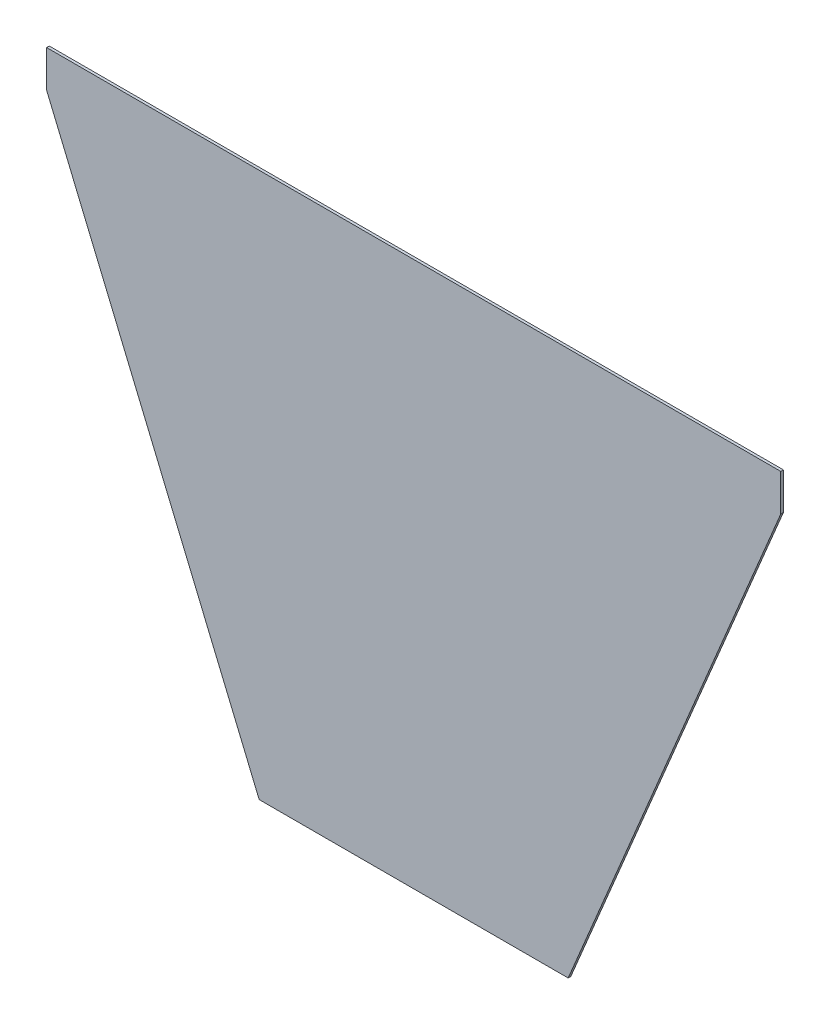
ISO-10303-21;
HEADER;
FILE_DESCRIPTION(('STEP AP214'),'2;1');
FILE_NAME('part.step','',(''),(''),'','','');
FILE_SCHEMA(('AUTOMOTIVE_DESIGN { 1 0 10303 214 1 1 1 1 }'));
ENDSEC;
DATA;
#1=APPLICATION_CONTEXT('core data for automotive mechanical design processes');
#2=APPLICATION_PROTOCOL_DEFINITION('international standard','automotive_design',2000,#1);
#3=PRODUCT_CONTEXT('',#1,'mechanical');
#4=PRODUCT('Part','Part','',(#3));
#5=PRODUCT_RELATED_PRODUCT_CATEGORY('part','',(#4));
#6=PRODUCT_DEFINITION_FORMATION('','',#4);
#7=PRODUCT_DEFINITION_CONTEXT('part definition',#1,'design');
#8=PRODUCT_DEFINITION('design','',#6,#7);
#9=PRODUCT_DEFINITION_SHAPE('','',#8);
#10=(LENGTH_UNIT() NAMED_UNIT(*) SI_UNIT(.MILLI.,.METRE.));
#11=(NAMED_UNIT(*) PLANE_ANGLE_UNIT() SI_UNIT($,.RADIAN.));
#12=(NAMED_UNIT(*) SI_UNIT($,.STERADIAN.) SOLID_ANGLE_UNIT());
#13=UNCERTAINTY_MEASURE_WITH_UNIT(LENGTH_MEASURE(1.E-05),#10,'distance_accuracy_value','');
#14=(GEOMETRIC_REPRESENTATION_CONTEXT(3) GLOBAL_UNCERTAINTY_ASSIGNED_CONTEXT((#13)) GLOBAL_UNIT_ASSIGNED_CONTEXT((#10,
#11,#12)) REPRESENTATION_CONTEXT('',''));
#15=CARTESIAN_POINT('',(0.,0.,0.));
#16=DIRECTION('',(0.,0.,1.));
#17=DIRECTION('',(1.,0.,0.));
#18=AXIS2_PLACEMENT_3D('',#15,#16,#17);
#19=CARTESIAN_POINT('',(-695.,0.,5.));
#20=DIRECTION('',(1.,0.,0.));
#21=DIRECTION('',(0.,0.,-1.));
#22=AXIS2_PLACEMENT_3D('',#19,#20,#21);
#23=PLANE('',#22);
#24=DIRECTION('',(0.,-1.,0.));
#25=VECTOR('',#24,1.);
#26=CARTESIAN_POINT('',(-695.,0.,0.));
#27=LINE('',#26,#25);
#28=CARTESIAN_POINT('',(-695.,0.,0.));
#29=VERTEX_POINT('',#28);
#30=CARTESIAN_POINT('',(-695.,-70.,0.));
#31=VERTEX_POINT('',#30);
#32=EDGE_CURVE('E118',#29,#31,#27,.T.);
#33=ORIENTED_EDGE('',*,*,#32,.T.);
#34=DIRECTION('',(0.,0.,-1.));
#35=VECTOR('',#34,1.);
#36=CARTESIAN_POINT('',(-695.,-70.,5.));
#37=LINE('',#36,#35);
#38=CARTESIAN_POINT('',(-695.,-70.,5.));
#39=VERTEX_POINT('',#38);
#40=EDGE_CURVE('E11',#39,#31,#37,.T.);
#41=ORIENTED_EDGE('',*,*,#40,.F.);
#42=DIRECTION('',(0.,-1.,0.));
#43=VECTOR('',#42,1.);
#44=CARTESIAN_POINT('',(-695.,0.,5.));
#45=LINE('',#44,#43);
#46=CARTESIAN_POINT('',(-695.,0.,5.));
#47=VERTEX_POINT('',#46);
#48=EDGE_CURVE('E128',#47,#39,#45,.T.);
#49=ORIENTED_EDGE('',*,*,#48,.F.);
#50=DIRECTION('',(0.,0.,-1.));
#51=VECTOR('',#50,1.);
#52=CARTESIAN_POINT('',(-695.,0.,5.));
#53=LINE('',#52,#51);
#54=EDGE_CURVE('E114',#47,#29,#53,.T.);
#55=ORIENTED_EDGE('',*,*,#54,.T.);
#56=EDGE_LOOP('',(#33,#41,#49,#55));
#57=FACE_BOUND('',#56,.T.);
#58=ADVANCED_FACE('F34',(#57),#23,.F.);
#59=CARTESIAN_POINT('',(-695.,-70.,5.));
#60=DIRECTION('',(0.922508493355555,0.385976786461134,0.));
#61=DIRECTION('',(-0.385976786461134,0.922508493355555,0.));
#62=AXIS2_PLACEMENT_3D('',#59,#60,#61);
#63=PLANE('',#62);
#64=DIRECTION('',(0.385976786461134,-0.922508493355555,0.));
#65=VECTOR('',#64,1.);
#66=CARTESIAN_POINT('',(-695.,-70.,0.));
#67=LINE('',#66,#65);
#68=CARTESIAN_POINT('',(-292.5,-1032.,0.));
#69=VERTEX_POINT('',#68);
#70=EDGE_CURVE('E121',#31,#69,#67,.T.);
#71=ORIENTED_EDGE('',*,*,#70,.T.);
#72=DIRECTION('',(0.,0.,-1.));
#73=VECTOR('',#72,1.);
#74=CARTESIAN_POINT('',(-292.5,-1032.,5.));
#75=LINE('',#74,#73);
#76=CARTESIAN_POINT('',(-292.5,-1032.,5.));
#77=VERTEX_POINT('',#76);
#78=EDGE_CURVE('E42',#77,#69,#75,.T.);
#79=ORIENTED_EDGE('',*,*,#78,.F.);
#80=DIRECTION('',(0.385976786461134,-0.922508493355555,0.));
#81=VECTOR('',#80,1.);
#82=CARTESIAN_POINT('',(-695.,-70.,5.));
#83=LINE('',#82,#81);
#84=EDGE_CURVE('E87',#39,#77,#83,.T.);
#85=ORIENTED_EDGE('',*,*,#84,.F.);
#86=ORIENTED_EDGE('',*,*,#40,.T.);
#87=EDGE_LOOP('',(#71,#79,#85,#86));
#88=FACE_BOUND('',#87,.T.);
#89=ADVANCED_FACE('F152',(#88),#63,.F.);
#90=CARTESIAN_POINT('',(-292.5,-1032.,5.));
#91=DIRECTION('',(0.,1.,0.));
#92=DIRECTION('',(0.,0.,1.));
#93=AXIS2_PLACEMENT_3D('',#90,#91,#92);
#94=PLANE('',#93);
#95=DIRECTION('',(1.,0.,0.));
#96=VECTOR('',#95,1.);
#97=CARTESIAN_POINT('',(-292.5,-1032.,0.));
#98=LINE('',#97,#96);
#99=CARTESIAN_POINT('',(292.5,-1032.,0.));
#100=VERTEX_POINT('',#99);
#101=EDGE_CURVE('E123',#69,#100,#98,.T.);
#102=ORIENTED_EDGE('',*,*,#101,.T.);
#103=DIRECTION('',(0.,0.,-1.));
#104=VECTOR('',#103,1.);
#105=CARTESIAN_POINT('',(292.5,-1032.,5.));
#106=LINE('',#105,#104);
#107=CARTESIAN_POINT('',(292.5,-1032.,5.));
#108=VERTEX_POINT('',#107);
#109=EDGE_CURVE('E109',#108,#100,#106,.T.);
#110=ORIENTED_EDGE('',*,*,#109,.F.);
#111=DIRECTION('',(1.,0.,0.));
#112=VECTOR('',#111,1.);
#113=CARTESIAN_POINT('',(-292.5,-1032.,5.));
#114=LINE('',#113,#112);
#115=EDGE_CURVE('E100',#77,#108,#114,.T.);
#116=ORIENTED_EDGE('',*,*,#115,.F.);
#117=ORIENTED_EDGE('',*,*,#78,.T.);
#118=EDGE_LOOP('',(#102,#110,#116,#117));
#119=FACE_BOUND('',#118,.T.);
#120=ADVANCED_FACE('F134',(#119),#94,.F.);
#121=CARTESIAN_POINT('',(695.,-70.,5.));
#122=DIRECTION('',(-0.922508493355555,0.385976786461134,0.));
#123=DIRECTION('',(-0.385976786461134,-0.922508493355555,0.));
#124=AXIS2_PLACEMENT_3D('',#121,#122,#123);
#125=PLANE('',#124);
#126=DIRECTION('',(0.385976786461134,0.922508493355555,0.));
#127=VECTOR('',#126,1.);
#128=CARTESIAN_POINT('',(695.,-70.,0.));
#129=LINE('',#128,#127);
#130=CARTESIAN_POINT('',(695.,-70.,0.));
#131=VERTEX_POINT('',#130);
#132=EDGE_CURVE('E108',#100,#131,#129,.T.);
#133=ORIENTED_EDGE('',*,*,#132,.T.);
#134=DIRECTION('',(0.,0.,-1.));
#135=VECTOR('',#134,1.);
#136=CARTESIAN_POINT('',(695.,-70.,5.));
#137=LINE('',#136,#135);
#138=CARTESIAN_POINT('',(695.,-70.,5.));
#139=VERTEX_POINT('',#138);
#140=EDGE_CURVE('E105',#139,#131,#137,.T.);
#141=ORIENTED_EDGE('',*,*,#140,.F.);
#142=DIRECTION('',(0.385976786461134,0.922508493355555,0.));
#143=VECTOR('',#142,1.);
#144=CARTESIAN_POINT('',(695.,-70.,5.));
#145=LINE('',#144,#143);
#146=EDGE_CURVE('E94',#108,#139,#145,.T.);
#147=ORIENTED_EDGE('',*,*,#146,.F.);
#148=ORIENTED_EDGE('',*,*,#109,.T.);
#149=EDGE_LOOP('',(#133,#141,#147,#148));
#150=FACE_BOUND('',#149,.T.);
#151=ADVANCED_FACE('F106',(#150),#125,.F.);
#152=CARTESIAN_POINT('',(695.,0.,5.));
#153=DIRECTION('',(-1.,0.,0.));
#154=DIRECTION('',(0.,0.,1.));
#155=AXIS2_PLACEMENT_3D('',#152,#153,#154);
#156=PLANE('',#155);
#157=DIRECTION('',(0.,1.,0.));
#158=VECTOR('',#157,1.);
#159=CARTESIAN_POINT('',(695.,0.,0.));
#160=LINE('',#159,#158);
#161=CARTESIAN_POINT('',(695.,0.,0.));
#162=VERTEX_POINT('',#161);
#163=EDGE_CURVE('E73',#131,#162,#160,.T.);
#164=ORIENTED_EDGE('',*,*,#163,.T.);
#165=DIRECTION('',(0.,0.,-1.));
#166=VECTOR('',#165,1.);
#167=CARTESIAN_POINT('',(695.,0.,5.));
#168=LINE('',#167,#166);
#169=CARTESIAN_POINT('',(695.,0.,5.));
#170=VERTEX_POINT('',#169);
#171=EDGE_CURVE('E110',#170,#162,#168,.T.);
#172=ORIENTED_EDGE('',*,*,#171,.F.);
#173=DIRECTION('',(0.,1.,0.));
#174=VECTOR('',#173,1.);
#175=CARTESIAN_POINT('',(695.,0.,5.));
#176=LINE('',#175,#174);
#177=EDGE_CURVE('E98',#139,#170,#176,.T.);
#178=ORIENTED_EDGE('',*,*,#177,.F.);
#179=ORIENTED_EDGE('',*,*,#140,.T.);
#180=EDGE_LOOP('',(#164,#172,#178,#179));
#181=FACE_BOUND('',#180,.T.);
#182=ADVANCED_FACE('F112',(#181),#156,.F.);
#183=CARTESIAN_POINT('',(-695.,0.,5.));
#184=DIRECTION('',(0.,-1.,0.));
#185=DIRECTION('',(0.,0.,-1.));
#186=AXIS2_PLACEMENT_3D('',#183,#184,#185);
#187=PLANE('',#186);
#188=DIRECTION('',(-1.,0.,0.));
#189=VECTOR('',#188,1.);
#190=CARTESIAN_POINT('',(-695.,0.,0.));
#191=LINE('',#190,#189);
#192=EDGE_CURVE('E79',#162,#29,#191,.T.);
#193=ORIENTED_EDGE('',*,*,#192,.T.);
#194=ORIENTED_EDGE('',*,*,#54,.F.);
#195=DIRECTION('',(-1.,0.,0.));
#196=VECTOR('',#195,1.);
#197=CARTESIAN_POINT('',(-695.,0.,5.));
#198=LINE('',#197,#196);
#199=EDGE_CURVE('E50',#170,#47,#198,.T.);
#200=ORIENTED_EDGE('',*,*,#199,.F.);
#201=ORIENTED_EDGE('',*,*,#171,.T.);
#202=EDGE_LOOP('',(#193,#194,#200,#201));
#203=FACE_BOUND('',#202,.T.);
#204=ADVANCED_FACE('F141',(#203),#187,.F.);
#205=CARTESIAN_POINT('',(-695.,-1032.,5.));
#206=DIRECTION('',(0.,0.,1.));
#207=DIRECTION('',(1.,0.,0.));
#208=AXIS2_PLACEMENT_3D('',#205,#206,#207);
#209=PLANE('',#208);
#210=ORIENTED_EDGE('',*,*,#48,.T.);
#211=ORIENTED_EDGE('',*,*,#84,.T.);
#212=ORIENTED_EDGE('',*,*,#115,.T.);
#213=ORIENTED_EDGE('',*,*,#146,.T.);
#214=ORIENTED_EDGE('',*,*,#177,.T.);
#215=ORIENTED_EDGE('',*,*,#199,.T.);
#216=EDGE_LOOP('',(#210,#211,#212,#213,#214,#215));
#217=FACE_BOUND('',#216,.T.);
#218=ADVANCED_FACE('F96',(#217),#209,.T.);
#219=CARTESIAN_POINT('',(-695.,-1032.,0.));
#220=DIRECTION('',(0.,0.,1.));
#221=DIRECTION('',(1.,0.,0.));
#222=AXIS2_PLACEMENT_3D('',#219,#220,#221);
#223=PLANE('',#222);
#224=ORIENTED_EDGE('',*,*,#32,.F.);
#225=ORIENTED_EDGE('',*,*,#192,.F.);
#226=ORIENTED_EDGE('',*,*,#163,.F.);
#227=ORIENTED_EDGE('',*,*,#132,.F.);
#228=ORIENTED_EDGE('',*,*,#101,.F.);
#229=ORIENTED_EDGE('',*,*,#70,.F.);
#230=EDGE_LOOP('',(#224,#225,#226,#227,#228,#229));
#231=FACE_BOUND('',#230,.T.);
#232=ADVANCED_FACE('F137',(#231),#223,.F.);
#233=CLOSED_SHELL('',(#58,#89,#120,#151,#182,#204,#218,#232));
#234=MANIFOLD_SOLID_BREP('B2',#233);
#235=ADVANCED_BREP_SHAPE_REPRESENTATION('',(#18,#234),#14);
#236=SHAPE_DEFINITION_REPRESENTATION(#9,#235);
ENDSEC;
END-ISO-10303-21;
